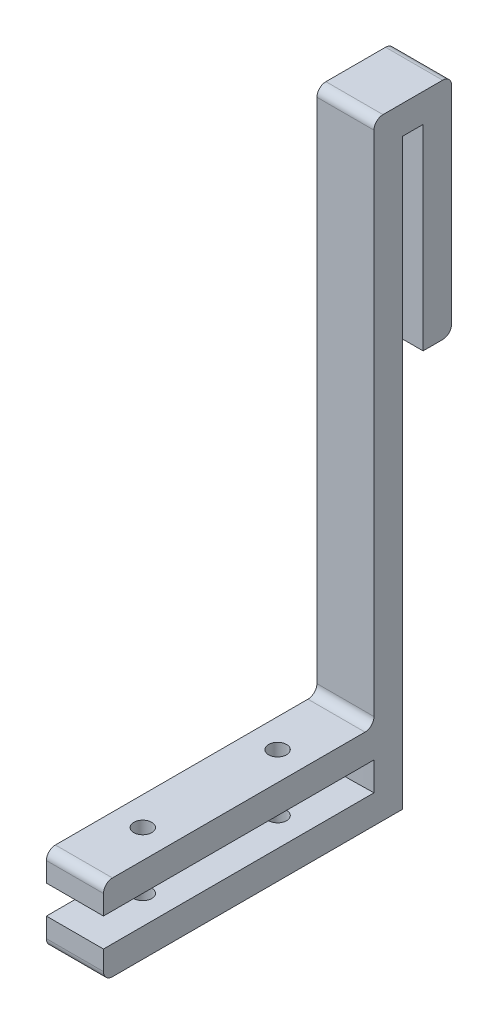
ISO-10303-21;
HEADER;
FILE_DESCRIPTION(('STEP AP214'),'2;1');
FILE_NAME('part.step','',(''),(''),'','','');
FILE_SCHEMA(('AUTOMOTIVE_DESIGN { 1 0 10303 214 1 1 1 1 }'));
ENDSEC;
DATA;
#1=APPLICATION_CONTEXT('core data for automotive mechanical design processes');
#2=APPLICATION_PROTOCOL_DEFINITION('international standard','automotive_design',2000,#1);
#3=PRODUCT_CONTEXT('',#1,'mechanical');
#4=PRODUCT('Part','Part','',(#3));
#5=PRODUCT_RELATED_PRODUCT_CATEGORY('part','',(#4));
#6=PRODUCT_DEFINITION_FORMATION('','',#4);
#7=PRODUCT_DEFINITION_CONTEXT('part definition',#1,'design');
#8=PRODUCT_DEFINITION('design','',#6,#7);
#9=PRODUCT_DEFINITION_SHAPE('','',#8);
#10=(LENGTH_UNIT() NAMED_UNIT(*) SI_UNIT(.MILLI.,.METRE.));
#11=(NAMED_UNIT(*) PLANE_ANGLE_UNIT() SI_UNIT($,.RADIAN.));
#12=(NAMED_UNIT(*) SI_UNIT($,.STERADIAN.) SOLID_ANGLE_UNIT());
#13=UNCERTAINTY_MEASURE_WITH_UNIT(LENGTH_MEASURE(1.E-05),#10,'distance_accuracy_value','');
#14=(GEOMETRIC_REPRESENTATION_CONTEXT(3) GLOBAL_UNCERTAINTY_ASSIGNED_CONTEXT((#13)) GLOBAL_UNIT_ASSIGNED_CONTEXT((#10,
#11,#12)) REPRESENTATION_CONTEXT('',''));
#15=CARTESIAN_POINT('',(0.,0.,0.));
#16=DIRECTION('',(0.,0.,1.));
#17=DIRECTION('',(1.,0.,0.));
#18=AXIS2_PLACEMENT_3D('',#15,#16,#17);
#19=CARTESIAN_POINT('',(0.,6.35,0.));
#20=DIRECTION('',(0.,-1.,0.));
#21=DIRECTION('',(0.,0.,-1.));
#22=AXIS2_PLACEMENT_3D('',#19,#20,#21);
#23=PLANE('',#22);
#24=CARTESIAN_POINT('',(6.35,6.35,-45.099));
#25=DIRECTION('',(0.,-1.,0.));
#26=DIRECTION('',(0.,0.,-1.));
#27=AXIS2_PLACEMENT_3D('',#24,#25,#26);
#28=CIRCLE('',#27,2.);
#29=CARTESIAN_POINT('',(6.35,6.35,-47.099));
#30=VERTEX_POINT('',#29);
#31=EDGE_CURVE('E207',#30,#30,#28,.T.);
#32=ORIENTED_EDGE('',*,*,#31,.T.);
#33=EDGE_LOOP('',(#32));
#34=FACE_BOUND('',#33,.T.);
#35=CARTESIAN_POINT('',(6.35,6.35,-15.099));
#36=DIRECTION('',(0.,-1.,0.));
#37=DIRECTION('',(0.,0.,-1.));
#38=AXIS2_PLACEMENT_3D('',#35,#36,#37);
#39=CIRCLE('',#38,2.);
#40=CARTESIAN_POINT('',(6.35,6.35,-17.099));
#41=VERTEX_POINT('',#40);
#42=EDGE_CURVE('E673',#41,#41,#39,.T.);
#43=ORIENTED_EDGE('',*,*,#42,.T.);
#44=EDGE_LOOP('',(#43));
#45=FACE_BOUND('',#44,.T.);
#46=CARTESIAN_POINT('',(6.35,6.35,-282.357267193606));
#47=DIRECTION('',(0.,1.,0.));
#48=DIRECTION('',(0.,0.,-1.));
#49=AXIS2_PLACEMENT_3D('',#46,#47,#48);
#50=CIRCLE('',#49,222.25);
#51=CARTESIAN_POINT('',(0.,6.35,-60.198));
#52=VERTEX_POINT('',#51);
#53=CARTESIAN_POINT('',(12.7,6.35,-60.198));
#54=VERTEX_POINT('',#53);
#55=EDGE_CURVE('E202',#52,#54,#50,.T.);
#56=ORIENTED_EDGE('',*,*,#55,.F.);
#57=DIRECTION('',(0.,0.,1.));
#58=VECTOR('',#57,1.);
#59=CARTESIAN_POINT('',(0.,6.35,0.));
#60=LINE('',#59,#58);
#61=CARTESIAN_POINT('',(0.,6.35,0.));
#62=VERTEX_POINT('',#61);
#63=EDGE_CURVE('E192',#52,#62,#60,.T.);
#64=ORIENTED_EDGE('',*,*,#63,.T.);
#65=DIRECTION('',(1.,0.,0.));
#66=VECTOR('',#65,1.);
#67=CARTESIAN_POINT('',(0.,6.35,0.));
#68=LINE('',#67,#66);
#69=CARTESIAN_POINT('',(12.7,6.35,0.));
#70=VERTEX_POINT('',#69);
#71=EDGE_CURVE('E262',#62,#70,#68,.T.);
#72=ORIENTED_EDGE('',*,*,#71,.T.);
#73=DIRECTION('',(0.,0.,-1.));
#74=VECTOR('',#73,1.);
#75=CARTESIAN_POINT('',(12.7,6.35,0.));
#76=LINE('',#75,#74);
#77=EDGE_CURVE('E265',#70,#54,#76,.T.);
#78=ORIENTED_EDGE('',*,*,#77,.T.);
#79=EDGE_LOOP('',(#56,#64,#72,#78));
#80=FACE_BOUND('',#79,.T.);
#81=ADVANCED_FACE('F37',(#34,#45,#80),#23,.F.);
#82=CARTESIAN_POINT('',(0.,12.7,0.));
#83=DIRECTION('',(0.,1.,0.));
#84=DIRECTION('',(0.,0.,1.));
#85=AXIS2_PLACEMENT_3D('',#82,#83,#84);
#86=PLANE('',#85);
#87=CARTESIAN_POINT('',(6.35,12.7,-45.099));
#88=DIRECTION('',(0.,1.,0.));
#89=DIRECTION('',(0.,0.,1.));
#90=AXIS2_PLACEMENT_3D('',#87,#88,#89);
#91=CIRCLE('',#90,2.);
#92=CARTESIAN_POINT('',(6.35,12.7,-43.099));
#93=VERTEX_POINT('',#92);
#94=EDGE_CURVE('E671',#93,#93,#91,.T.);
#95=ORIENTED_EDGE('',*,*,#94,.T.);
#96=EDGE_LOOP('',(#95));
#97=FACE_BOUND('',#96,.T.);
#98=CARTESIAN_POINT('',(6.35,12.7,-15.099));
#99=DIRECTION('',(0.,1.,0.));
#100=DIRECTION('',(0.,0.,1.));
#101=AXIS2_PLACEMENT_3D('',#98,#99,#100);
#102=CIRCLE('',#101,2.);
#103=CARTESIAN_POINT('',(6.35,12.7,-13.099));
#104=VERTEX_POINT('',#103);
#105=EDGE_CURVE('E676',#104,#104,#102,.T.);
#106=ORIENTED_EDGE('',*,*,#105,.T.);
#107=EDGE_LOOP('',(#106));
#108=FACE_BOUND('',#107,.T.);
#109=CARTESIAN_POINT('',(6.35,12.7,-282.357267193606));
#110=DIRECTION('',(0.,1.,0.));
#111=DIRECTION('',(0.,0.,-1.));
#112=AXIS2_PLACEMENT_3D('',#109,#110,#111);
#113=CIRCLE('',#112,222.25);
#114=CARTESIAN_POINT('',(0.,12.7,-60.198));
#115=VERTEX_POINT('',#114);
#116=CARTESIAN_POINT('',(12.7,12.7,-60.198));
#117=VERTEX_POINT('',#116);
#118=EDGE_CURVE('E178',#115,#117,#113,.T.);
#119=ORIENTED_EDGE('',*,*,#118,.T.);
#120=DIRECTION('',(0.,0.,-1.));
#121=VECTOR('',#120,1.);
#122=CARTESIAN_POINT('',(12.7,12.7,-66.548));
#123=LINE('',#122,#121);
#124=CARTESIAN_POINT('',(12.7,12.7,0.));
#125=VERTEX_POINT('',#124);
#126=EDGE_CURVE('E252',#125,#117,#123,.T.);
#127=ORIENTED_EDGE('',*,*,#126,.F.);
#128=DIRECTION('',(1.,0.,0.));
#129=VECTOR('',#128,1.);
#130=CARTESIAN_POINT('',(0.,12.7,0.));
#131=LINE('',#130,#129);
#132=CARTESIAN_POINT('',(0.,12.7,0.));
#133=VERTEX_POINT('',#132);
#134=EDGE_CURVE('E181',#133,#125,#131,.T.);
#135=ORIENTED_EDGE('',*,*,#134,.F.);
#136=DIRECTION('',(0.,0.,1.));
#137=VECTOR('',#136,1.);
#138=CARTESIAN_POINT('',(0.,12.7,-66.548));
#139=LINE('',#138,#137);
#140=EDGE_CURVE('E173',#115,#133,#139,.T.);
#141=ORIENTED_EDGE('',*,*,#140,.F.);
#142=EDGE_LOOP('',(#119,#127,#135,#141));
#143=FACE_BOUND('',#142,.T.);
#144=ADVANCED_FACE('F175',(#97,#108,#143),#86,.F.);
#145=CARTESIAN_POINT('',(0.,6.35,-66.548));
#146=DIRECTION('',(0.,0.,1.));
#147=DIRECTION('',(1.,0.,0.));
#148=AXIS2_PLACEMENT_3D('',#145,#146,#147);
#149=PLANE('',#148);
#150=DIRECTION('',(-1.,0.,0.));
#151=VECTOR('',#150,1.);
#152=CARTESIAN_POINT('',(12.7,129.7,-66.548));
#153=LINE('',#152,#151);
#154=CARTESIAN_POINT('',(12.7,129.7,-66.548));
#155=VERTEX_POINT('',#154);
#156=CARTESIAN_POINT('',(0.,129.7,-66.548));
#157=VERTEX_POINT('',#156);
#158=EDGE_CURVE('E227',#155,#157,#153,.T.);
#159=ORIENTED_EDGE('',*,*,#158,.F.);
#160=DIRECTION('',(0.,-1.,0.));
#161=VECTOR('',#160,1.);
#162=CARTESIAN_POINT('',(12.7,6.35,-66.548));
#163=LINE('',#162,#161);
#164=CARTESIAN_POINT('',(12.7,0.,-66.548));
#165=VERTEX_POINT('',#164);
#166=EDGE_CURVE('E274',#155,#165,#163,.T.);
#167=ORIENTED_EDGE('',*,*,#166,.T.);
#168=DIRECTION('',(-1.,0.,0.));
#169=VECTOR('',#168,1.);
#170=CARTESIAN_POINT('',(0.,0.,-66.548));
#171=LINE('',#170,#169);
#172=CARTESIAN_POINT('',(0.,0.,-66.548));
#173=VERTEX_POINT('',#172);
#174=EDGE_CURVE('E263',#165,#173,#171,.T.);
#175=ORIENTED_EDGE('',*,*,#174,.T.);
#176=DIRECTION('',(0.,-1.,0.));
#177=VECTOR('',#176,1.);
#178=CARTESIAN_POINT('',(0.,6.35,-66.548));
#179=LINE('',#178,#177);
#180=EDGE_CURVE('E267',#157,#173,#179,.T.);
#181=ORIENTED_EDGE('',*,*,#180,.F.);
#182=EDGE_LOOP('',(#159,#167,#175,#181));
#183=FACE_BOUND('',#182,.T.);
#184=ADVANCED_FACE('F377',(#183),#149,.F.);
#185=CARTESIAN_POINT('',(0.,6.35,0.));
#186=DIRECTION('',(1.,0.,0.));
#187=DIRECTION('',(0.,0.,-1.));
#188=AXIS2_PLACEMENT_3D('',#185,#186,#187);
#189=PLANE('',#188);
#190=DIRECTION('',(0.,0.,1.));
#191=VECTOR('',#190,1.);
#192=CARTESIAN_POINT('',(0.,0.,0.));
#193=LINE('',#192,#191);
#194=CARTESIAN_POINT('',(0.,0.,-2.));
#195=VERTEX_POINT('',#194);
#196=EDGE_CURVE('E195',#173,#195,#193,.T.);
#197=ORIENTED_EDGE('',*,*,#196,.T.);
#198=CARTESIAN_POINT('',(0.,2.,-2.));
#199=DIRECTION('',(1.,0.,0.));
#200=DIRECTION('',(0.,0.,-1.));
#201=AXIS2_PLACEMENT_3D('',#198,#199,#200);
#202=CIRCLE('',#201,2.);
#203=CARTESIAN_POINT('',(0.,2.,0.));
#204=VERTEX_POINT('',#203);
#205=EDGE_CURVE('E307',#195,#204,#202,.F.);
#206=ORIENTED_EDGE('',*,*,#205,.T.);
#207=DIRECTION('',(0.,-1.,0.));
#208=VECTOR('',#207,1.);
#209=CARTESIAN_POINT('',(0.,6.35,0.));
#210=LINE('',#209,#208);
#211=EDGE_CURVE('E280',#62,#204,#210,.T.);
#212=ORIENTED_EDGE('',*,*,#211,.F.);
#213=ORIENTED_EDGE('',*,*,#63,.F.);
#214=DIRECTION('',(0.,-1.,0.));
#215=VECTOR('',#214,1.);
#216=CARTESIAN_POINT('',(0.,12.7,-60.198));
#217=LINE('',#216,#215);
#218=EDGE_CURVE('E188',#115,#52,#217,.T.);
#219=ORIENTED_EDGE('',*,*,#218,.F.);
#220=ORIENTED_EDGE('',*,*,#140,.T.);
#221=DIRECTION('',(0.,-1.,0.));
#222=VECTOR('',#221,1.);
#223=CARTESIAN_POINT('',(0.,19.05,0.));
#224=LINE('',#223,#222);
#225=CARTESIAN_POINT('',(0.,17.05,0.));
#226=VERTEX_POINT('',#225);
#227=EDGE_CURVE('E258',#226,#133,#224,.T.);
#228=ORIENTED_EDGE('',*,*,#227,.F.);
#229=CARTESIAN_POINT('',(0.,17.05,-2.));
#230=DIRECTION('',(1.,0.,0.));
#231=DIRECTION('',(0.,0.,-1.));
#232=AXIS2_PLACEMENT_3D('',#229,#230,#231);
#233=CIRCLE('',#232,2.);
#234=CARTESIAN_POINT('',(0.,19.05,-2.));
#235=VERTEX_POINT('',#234);
#236=EDGE_CURVE('E304',#226,#235,#233,.F.);
#237=ORIENTED_EDGE('',*,*,#236,.T.);
#238=DIRECTION('',(0.,0.,1.));
#239=VECTOR('',#238,1.);
#240=CARTESIAN_POINT('',(0.,19.05,-66.548));
#241=LINE('',#240,#239);
#242=CARTESIAN_POINT('',(0.,19.05,-58.198));
#243=VERTEX_POINT('',#242);
#244=EDGE_CURVE('E249',#243,#235,#241,.T.);
#245=ORIENTED_EDGE('',*,*,#244,.F.);
#246=CARTESIAN_POINT('',(0.,21.05,-58.198));
#247=DIRECTION('',(1.,0.,0.));
#248=DIRECTION('',(0.,0.,-1.));
#249=AXIS2_PLACEMENT_3D('',#246,#247,#248);
#250=CIRCLE('',#249,2.);
#251=CARTESIAN_POINT('',(0.,21.05,-60.198));
#252=VERTEX_POINT('',#251);
#253=EDGE_CURVE('E11',#243,#252,#250,.T.);
#254=ORIENTED_EDGE('',*,*,#253,.T.);
#255=DIRECTION('',(0.,-1.,0.));
#256=VECTOR('',#255,1.);
#257=CARTESIAN_POINT('',(0.,136.05,-60.198));
#258=LINE('',#257,#256);
#259=CARTESIAN_POINT('',(0.,134.05,-60.198));
#260=VERTEX_POINT('',#259);
#261=EDGE_CURVE('E184',#260,#252,#258,.T.);
#262=ORIENTED_EDGE('',*,*,#261,.F.);
#263=CARTESIAN_POINT('',(0.,134.05,-62.198));
#264=DIRECTION('',(1.,0.,0.));
#265=DIRECTION('',(0.,0.,-1.));
#266=AXIS2_PLACEMENT_3D('',#263,#264,#265);
#267=CIRCLE('',#266,2.);
#268=CARTESIAN_POINT('',(0.,136.05,-62.198));
#269=VERTEX_POINT('',#268);
#270=EDGE_CURVE('E298',#260,#269,#267,.F.);
#271=ORIENTED_EDGE('',*,*,#270,.T.);
#272=DIRECTION('',(0.,0.,1.));
#273=VECTOR('',#272,1.);
#274=CARTESIAN_POINT('',(0.,136.05,-66.548));
#275=LINE('',#274,#273);
#276=CARTESIAN_POINT('',(0.,136.05,-75.47));
#277=VERTEX_POINT('',#276);
#278=EDGE_CURVE('E239',#277,#269,#275,.T.);
#279=ORIENTED_EDGE('',*,*,#278,.F.);
#280=CARTESIAN_POINT('',(0.,134.05,-75.47));
#281=DIRECTION('',(1.,0.,0.));
#282=DIRECTION('',(0.,0.,-1.));
#283=AXIS2_PLACEMENT_3D('',#280,#281,#282);
#284=CIRCLE('',#283,2.);
#285=CARTESIAN_POINT('',(0.,134.05,-77.47));
#286=VERTEX_POINT('',#285);
#287=EDGE_CURVE('E300',#277,#286,#284,.F.);
#288=ORIENTED_EDGE('',*,*,#287,.T.);
#289=DIRECTION('',(0.,1.,0.));
#290=VECTOR('',#289,1.);
#291=CARTESIAN_POINT('',(0.,136.05,-77.47));
#292=LINE('',#291,#290);
#293=CARTESIAN_POINT('',(0.,88.05,-77.47));
#294=VERTEX_POINT('',#293);
#295=EDGE_CURVE('E215',#294,#286,#292,.T.);
#296=ORIENTED_EDGE('',*,*,#295,.F.);
#297=CARTESIAN_POINT('',(0.,88.05,-75.47));
#298=DIRECTION('',(1.,0.,0.));
#299=DIRECTION('',(0.,0.,-1.));
#300=AXIS2_PLACEMENT_3D('',#297,#298,#299);
#301=CIRCLE('',#300,2.);
#302=CARTESIAN_POINT('',(0.,86.05,-75.47));
#303=VERTEX_POINT('',#302);
#304=EDGE_CURVE('E302',#294,#303,#301,.F.);
#305=ORIENTED_EDGE('',*,*,#304,.T.);
#306=DIRECTION('',(0.,0.,1.));
#307=VECTOR('',#306,1.);
#308=CARTESIAN_POINT('',(0.,86.05,-77.47));
#309=LINE('',#308,#307);
#310=CARTESIAN_POINT('',(0.,86.05,-71.12));
#311=VERTEX_POINT('',#310);
#312=EDGE_CURVE('E218',#303,#311,#309,.T.);
#313=ORIENTED_EDGE('',*,*,#312,.T.);
#314=DIRECTION('',(0.,1.,0.));
#315=VECTOR('',#314,1.);
#316=CARTESIAN_POINT('',(0.,136.05,-71.12));
#317=LINE('',#316,#315);
#318=CARTESIAN_POINT('',(0.,129.7,-71.12));
#319=VERTEX_POINT('',#318);
#320=EDGE_CURVE('E216',#311,#319,#317,.T.);
#321=ORIENTED_EDGE('',*,*,#320,.T.);
#322=DIRECTION('',(0.,0.,1.));
#323=VECTOR('',#322,1.);
#324=CARTESIAN_POINT('',(0.,129.7,-71.12));
#325=LINE('',#324,#323);
#326=EDGE_CURVE('E231',#319,#157,#325,.T.);
#327=ORIENTED_EDGE('',*,*,#326,.T.);
#328=ORIENTED_EDGE('',*,*,#180,.T.);
#329=EDGE_LOOP('',(#197,#206,#212,#213,#219,#220,#228,#237,#245,#254,#262,#271,#279,#288,#296,
#305,#313,#321,#327,#328));
#330=FACE_BOUND('',#329,.T.);
#331=ADVANCED_FACE('F190',(#330),#189,.F.);
#332=CARTESIAN_POINT('',(0.,6.35,0.));
#333=DIRECTION('',(0.,0.,-1.));
#334=DIRECTION('',(-1.,0.,0.));
#335=AXIS2_PLACEMENT_3D('',#332,#333,#334);
#336=PLANE('',#335);
#337=ORIENTED_EDGE('',*,*,#211,.T.);
#338=DIRECTION('',(1.,0.,0.));
#339=VECTOR('',#338,1.);
#340=CARTESIAN_POINT('',(12.7,2.,0.));
#341=LINE('',#340,#339);
#342=CARTESIAN_POINT('',(12.7,2.,0.));
#343=VERTEX_POINT('',#342);
#344=EDGE_CURVE('E283',#204,#343,#341,.T.);
#345=ORIENTED_EDGE('',*,*,#344,.T.);
#346=DIRECTION('',(0.,-1.,0.));
#347=VECTOR('',#346,1.);
#348=CARTESIAN_POINT('',(12.7,6.35,0.));
#349=LINE('',#348,#347);
#350=EDGE_CURVE('E277',#70,#343,#349,.T.);
#351=ORIENTED_EDGE('',*,*,#350,.F.);
#352=ORIENTED_EDGE('',*,*,#71,.F.);
#353=EDGE_LOOP('',(#337,#345,#351,#352));
#354=FACE_BOUND('',#353,.T.);
#355=ADVANCED_FACE('F390',(#354),#336,.F.);
#356=CARTESIAN_POINT('',(12.7,6.35,0.));
#357=DIRECTION('',(-1.,0.,0.));
#358=DIRECTION('',(0.,0.,1.));
#359=AXIS2_PLACEMENT_3D('',#356,#357,#358);
#360=PLANE('',#359);
#361=ORIENTED_EDGE('',*,*,#350,.T.);
#362=CARTESIAN_POINT('',(12.7,2.,-2.));
#363=DIRECTION('',(-1.,0.,0.));
#364=DIRECTION('',(0.,0.,1.));
#365=AXIS2_PLACEMENT_3D('',#362,#363,#364);
#366=CIRCLE('',#365,2.);
#367=CARTESIAN_POINT('',(12.7,0.,-2.));
#368=VERTEX_POINT('',#367);
#369=EDGE_CURVE('E294',#343,#368,#366,.F.);
#370=ORIENTED_EDGE('',*,*,#369,.T.);
#371=DIRECTION('',(0.,0.,-1.));
#372=VECTOR('',#371,1.);
#373=CARTESIAN_POINT('',(12.7,0.,0.));
#374=LINE('',#373,#372);
#375=EDGE_CURVE('E269',#368,#165,#374,.T.);
#376=ORIENTED_EDGE('',*,*,#375,.T.);
#377=ORIENTED_EDGE('',*,*,#166,.F.);
#378=DIRECTION('',(0.,0.,1.));
#379=VECTOR('',#378,1.);
#380=CARTESIAN_POINT('',(12.7,129.7,-71.12));
#381=LINE('',#380,#379);
#382=CARTESIAN_POINT('',(12.7,129.7,-71.12));
#383=VERTEX_POINT('',#382);
#384=EDGE_CURVE('E236',#383,#155,#381,.T.);
#385=ORIENTED_EDGE('',*,*,#384,.F.);
#386=DIRECTION('',(0.,-1.,0.));
#387=VECTOR('',#386,1.);
#388=CARTESIAN_POINT('',(12.7,136.05,-71.12));
#389=LINE('',#388,#387);
#390=CARTESIAN_POINT('',(12.7,86.05,-71.12));
#391=VERTEX_POINT('',#390);
#392=EDGE_CURVE('E201',#383,#391,#389,.T.);
#393=ORIENTED_EDGE('',*,*,#392,.T.);
#394=DIRECTION('',(0.,0.,1.));
#395=VECTOR('',#394,1.);
#396=CARTESIAN_POINT('',(12.7,86.05,-77.47));
#397=LINE('',#396,#395);
#398=CARTESIAN_POINT('',(12.7,86.05,-75.47));
#399=VERTEX_POINT('',#398);
#400=EDGE_CURVE('E225',#399,#391,#397,.T.);
#401=ORIENTED_EDGE('',*,*,#400,.F.);
#402=CARTESIAN_POINT('',(12.7,88.05,-75.47));
#403=DIRECTION('',(-1.,0.,0.));
#404=DIRECTION('',(0.,0.,1.));
#405=AXIS2_PLACEMENT_3D('',#402,#403,#404);
#406=CIRCLE('',#405,2.);
#407=CARTESIAN_POINT('',(12.7,88.05,-77.47));
#408=VERTEX_POINT('',#407);
#409=EDGE_CURVE('E290',#399,#408,#406,.F.);
#410=ORIENTED_EDGE('',*,*,#409,.T.);
#411=DIRECTION('',(0.,-1.,0.));
#412=VECTOR('',#411,1.);
#413=CARTESIAN_POINT('',(12.7,136.05,-77.47));
#414=LINE('',#413,#412);
#415=CARTESIAN_POINT('',(12.7,134.05,-77.47));
#416=VERTEX_POINT('',#415);
#417=EDGE_CURVE('E212',#416,#408,#414,.T.);
#418=ORIENTED_EDGE('',*,*,#417,.F.);
#419=CARTESIAN_POINT('',(12.7,134.05,-75.47));
#420=DIRECTION('',(-1.,0.,0.));
#421=DIRECTION('',(0.,0.,1.));
#422=AXIS2_PLACEMENT_3D('',#419,#420,#421);
#423=CIRCLE('',#422,2.);
#424=CARTESIAN_POINT('',(12.7,136.05,-75.47));
#425=VERTEX_POINT('',#424);
#426=EDGE_CURVE('E288',#416,#425,#423,.F.);
#427=ORIENTED_EDGE('',*,*,#426,.T.);
#428=DIRECTION('',(0.,0.,-1.));
#429=VECTOR('',#428,1.);
#430=CARTESIAN_POINT('',(12.7,136.05,-66.548));
#431=LINE('',#430,#429);
#432=CARTESIAN_POINT('',(12.7,136.05,-62.198));
#433=VERTEX_POINT('',#432);
#434=EDGE_CURVE('E242',#433,#425,#431,.T.);
#435=ORIENTED_EDGE('',*,*,#434,.F.);
#436=CARTESIAN_POINT('',(12.7,134.05,-62.198));
#437=DIRECTION('',(-1.,0.,0.));
#438=DIRECTION('',(0.,0.,1.));
#439=AXIS2_PLACEMENT_3D('',#436,#437,#438);
#440=CIRCLE('',#439,2.);
#441=CARTESIAN_POINT('',(12.7,134.05,-60.198));
#442=VERTEX_POINT('',#441);
#443=EDGE_CURVE('E286',#433,#442,#440,.F.);
#444=ORIENTED_EDGE('',*,*,#443,.T.);
#445=DIRECTION('',(0.,-1.,0.));
#446=VECTOR('',#445,1.);
#447=CARTESIAN_POINT('',(12.7,136.05,-60.198));
#448=LINE('',#447,#446);
#449=CARTESIAN_POINT('',(12.7,21.05,-60.198));
#450=VERTEX_POINT('',#449);
#451=EDGE_CURVE('E245',#442,#450,#448,.T.);
#452=ORIENTED_EDGE('',*,*,#451,.T.);
#453=CARTESIAN_POINT('',(12.7,21.05,-58.198));
#454=DIRECTION('',(-1.,0.,0.));
#455=DIRECTION('',(0.,0.,1.));
#456=AXIS2_PLACEMENT_3D('',#453,#454,#455);
#457=CIRCLE('',#456,2.);
#458=CARTESIAN_POINT('',(12.7,19.05,-58.198));
#459=VERTEX_POINT('',#458);
#460=EDGE_CURVE('E45',#450,#459,#457,.T.);
#461=ORIENTED_EDGE('',*,*,#460,.T.);
#462=DIRECTION('',(0.,0.,-1.));
#463=VECTOR('',#462,1.);
#464=CARTESIAN_POINT('',(12.7,19.05,-66.548));
#465=LINE('',#464,#463);
#466=CARTESIAN_POINT('',(12.7,19.05,-2.));
#467=VERTEX_POINT('',#466);
#468=EDGE_CURVE('E251',#467,#459,#465,.T.);
#469=ORIENTED_EDGE('',*,*,#468,.F.);
#470=CARTESIAN_POINT('',(12.7,17.05,-2.));
#471=DIRECTION('',(-1.,0.,0.));
#472=DIRECTION('',(0.,0.,1.));
#473=AXIS2_PLACEMENT_3D('',#470,#471,#472);
#474=CIRCLE('',#473,2.);
#475=CARTESIAN_POINT('',(12.7,17.05,0.));
#476=VERTEX_POINT('',#475);
#477=EDGE_CURVE('E292',#467,#476,#474,.F.);
#478=ORIENTED_EDGE('',*,*,#477,.T.);
#479=DIRECTION('',(0.,-1.,0.));
#480=VECTOR('',#479,1.);
#481=CARTESIAN_POINT('',(12.7,19.05,0.));
#482=LINE('',#481,#480);
#483=EDGE_CURVE('E253',#476,#125,#482,.T.);
#484=ORIENTED_EDGE('',*,*,#483,.T.);
#485=ORIENTED_EDGE('',*,*,#126,.T.);
#486=DIRECTION('',(0.,-1.,0.));
#487=VECTOR('',#486,1.);
#488=CARTESIAN_POINT('',(12.7,12.7,-60.198));
#489=LINE('',#488,#487);
#490=EDGE_CURVE('E196',#117,#54,#489,.T.);
#491=ORIENTED_EDGE('',*,*,#490,.T.);
#492=ORIENTED_EDGE('',*,*,#77,.F.);
#493=EDGE_LOOP('',(#361,#370,#376,#377,#385,#393,#401,#410,#418,#427,#435,#444,#452,#461,#469,
#478,#484,#485,#491,#492));
#494=FACE_BOUND('',#493,.T.);
#495=ADVANCED_FACE('F340',(#494),#360,.F.);
#496=CARTESIAN_POINT('',(0.,0.,0.));
#497=DIRECTION('',(0.,-1.,0.));
#498=DIRECTION('',(0.,0.,-1.));
#499=AXIS2_PLACEMENT_3D('',#496,#497,#498);
#500=PLANE('',#499);
#501=CARTESIAN_POINT('',(6.35,0.,-45.099));
#502=DIRECTION('',(0.,1.,0.));
#503=DIRECTION('',(0.,0.,1.));
#504=AXIS2_PLACEMENT_3D('',#501,#502,#503);
#505=CIRCLE('',#504,2.);
#506=CARTESIAN_POINT('',(6.35,0.,-43.099));
#507=VERTEX_POINT('',#506);
#508=EDGE_CURVE('E669',#507,#507,#505,.T.);
#509=ORIENTED_EDGE('',*,*,#508,.T.);
#510=EDGE_LOOP('',(#509));
#511=FACE_BOUND('',#510,.T.);
#512=CARTESIAN_POINT('',(6.35,0.,-15.099));
#513=DIRECTION('',(0.,1.,0.));
#514=DIRECTION('',(0.,0.,-1.));
#515=AXIS2_PLACEMENT_3D('',#512,#513,#514);
#516=CIRCLE('',#515,2.);
#517=CARTESIAN_POINT('',(6.35,0.,-17.099));
#518=VERTEX_POINT('',#517);
#519=EDGE_CURVE('E684',#518,#518,#516,.T.);
#520=ORIENTED_EDGE('',*,*,#519,.T.);
#521=EDGE_LOOP('',(#520));
#522=FACE_BOUND('',#521,.T.);
#523=ORIENTED_EDGE('',*,*,#375,.F.);
#524=DIRECTION('',(1.,0.,0.));
#525=VECTOR('',#524,1.);
#526=CARTESIAN_POINT('',(0.,0.,-2.));
#527=LINE('',#526,#525);
#528=EDGE_CURVE('E296',#368,#195,#527,.F.);
#529=ORIENTED_EDGE('',*,*,#528,.T.);
#530=ORIENTED_EDGE('',*,*,#196,.F.);
#531=ORIENTED_EDGE('',*,*,#174,.F.);
#532=EDGE_LOOP('',(#523,#529,#530,#531));
#533=FACE_BOUND('',#532,.T.);
#534=ADVANCED_FACE('F382',(#511,#522,#533),#500,.T.);
#535=CARTESIAN_POINT('',(0.,19.05,0.));
#536=DIRECTION('',(0.,0.,-1.));
#537=DIRECTION('',(-1.,0.,0.));
#538=AXIS2_PLACEMENT_3D('',#535,#536,#537);
#539=PLANE('',#538);
#540=ORIENTED_EDGE('',*,*,#483,.F.);
#541=DIRECTION('',(1.,0.,0.));
#542=VECTOR('',#541,1.);
#543=CARTESIAN_POINT('',(0.,17.05,0.));
#544=LINE('',#543,#542);
#545=EDGE_CURVE('E312',#476,#226,#544,.F.);
#546=ORIENTED_EDGE('',*,*,#545,.T.);
#547=ORIENTED_EDGE('',*,*,#227,.T.);
#548=ORIENTED_EDGE('',*,*,#134,.T.);
#549=EDGE_LOOP('',(#540,#546,#547,#548));
#550=FACE_BOUND('',#549,.T.);
#551=ADVANCED_FACE('F397',(#550),#539,.F.);
#552=CARTESIAN_POINT('',(0.,19.05,0.));
#553=DIRECTION('',(0.,1.,0.));
#554=DIRECTION('',(0.,0.,1.));
#555=AXIS2_PLACEMENT_3D('',#552,#553,#554);
#556=PLANE('',#555);
#557=CARTESIAN_POINT('',(6.35,19.05,-45.099));
#558=DIRECTION('',(0.,1.,0.));
#559=DIRECTION('',(0.,0.,1.));
#560=AXIS2_PLACEMENT_3D('',#557,#558,#559);
#561=CIRCLE('',#560,2.);
#562=CARTESIAN_POINT('',(6.35,19.05,-43.099));
#563=VERTEX_POINT('',#562);
#564=EDGE_CURVE('E687',#563,#563,#561,.T.);
#565=ORIENTED_EDGE('',*,*,#564,.F.);
#566=EDGE_LOOP('',(#565));
#567=FACE_BOUND('',#566,.T.);
#568=CARTESIAN_POINT('',(6.35,19.05,-15.099));
#569=DIRECTION('',(0.,1.,0.));
#570=DIRECTION('',(0.,0.,-1.));
#571=AXIS2_PLACEMENT_3D('',#568,#569,#570);
#572=CIRCLE('',#571,2.);
#573=CARTESIAN_POINT('',(6.35,19.05,-17.099));
#574=VERTEX_POINT('',#573);
#575=EDGE_CURVE('E681',#574,#574,#572,.T.);
#576=ORIENTED_EDGE('',*,*,#575,.F.);
#577=EDGE_LOOP('',(#576));
#578=FACE_BOUND('',#577,.T.);
#579=ORIENTED_EDGE('',*,*,#468,.T.);
#580=DIRECTION('',(1.,0.,0.));
#581=VECTOR('',#580,1.);
#582=CARTESIAN_POINT('',(0.,19.05,-58.198));
#583=LINE('',#582,#581);
#584=EDGE_CURVE('E58',#459,#243,#583,.F.);
#585=ORIENTED_EDGE('',*,*,#584,.T.);
#586=ORIENTED_EDGE('',*,*,#244,.T.);
#587=DIRECTION('',(1.,0.,0.));
#588=VECTOR('',#587,1.);
#589=CARTESIAN_POINT('',(12.7,19.05,-2.));
#590=LINE('',#589,#588);
#591=EDGE_CURVE('E309',#235,#467,#590,.T.);
#592=ORIENTED_EDGE('',*,*,#591,.T.);
#593=EDGE_LOOP('',(#579,#585,#586,#592));
#594=FACE_BOUND('',#593,.T.);
#595=ADVANCED_FACE('F402',(#567,#578,#594),#556,.T.);
#596=CARTESIAN_POINT('',(0.,136.05,-60.198));
#597=DIRECTION('',(0.,0.,-1.));
#598=DIRECTION('',(-1.,0.,0.));
#599=AXIS2_PLACEMENT_3D('',#596,#597,#598);
#600=PLANE('',#599);
#601=ORIENTED_EDGE('',*,*,#261,.T.);
#602=DIRECTION('',(1.,0.,0.));
#603=VECTOR('',#602,1.);
#604=CARTESIAN_POINT('',(0.,21.05,-60.198));
#605=LINE('',#604,#603);
#606=EDGE_CURVE('E329',#252,#450,#605,.T.);
#607=ORIENTED_EDGE('',*,*,#606,.T.);
#608=ORIENTED_EDGE('',*,*,#451,.F.);
#609=DIRECTION('',(1.,0.,0.));
#610=VECTOR('',#609,1.);
#611=CARTESIAN_POINT('',(0.,134.05,-60.198));
#612=LINE('',#611,#610);
#613=EDGE_CURVE('E327',#442,#260,#612,.F.);
#614=ORIENTED_EDGE('',*,*,#613,.T.);
#615=EDGE_LOOP('',(#601,#607,#608,#614));
#616=FACE_BOUND('',#615,.T.);
#617=ADVANCED_FACE('F335',(#616),#600,.F.);
#618=CARTESIAN_POINT('',(0.,136.05,0.));
#619=DIRECTION('',(0.,1.,0.));
#620=DIRECTION('',(0.,0.,1.));
#621=AXIS2_PLACEMENT_3D('',#618,#619,#620);
#622=PLANE('',#621);
#623=ORIENTED_EDGE('',*,*,#434,.T.);
#624=DIRECTION('',(1.,0.,0.));
#625=VECTOR('',#624,1.);
#626=CARTESIAN_POINT('',(0.,136.05,-75.47));
#627=LINE('',#626,#625);
#628=EDGE_CURVE('E325',#425,#277,#627,.F.);
#629=ORIENTED_EDGE('',*,*,#628,.T.);
#630=ORIENTED_EDGE('',*,*,#278,.T.);
#631=DIRECTION('',(1.,0.,0.));
#632=VECTOR('',#631,1.);
#633=CARTESIAN_POINT('',(12.7,136.05,-62.198));
#634=LINE('',#633,#632);
#635=EDGE_CURVE('E322',#269,#433,#634,.T.);
#636=ORIENTED_EDGE('',*,*,#635,.T.);
#637=EDGE_LOOP('',(#623,#629,#630,#636));
#638=FACE_BOUND('',#637,.T.);
#639=ADVANCED_FACE('F347',(#638),#622,.T.);
#640=CARTESIAN_POINT('',(12.7,129.7,-71.12));
#641=DIRECTION('',(0.,1.,0.));
#642=DIRECTION('',(0.,0.,1.));
#643=AXIS2_PLACEMENT_3D('',#640,#641,#642);
#644=PLANE('',#643);
#645=ORIENTED_EDGE('',*,*,#158,.T.);
#646=ORIENTED_EDGE('',*,*,#326,.F.);
#647=DIRECTION('',(-1.,0.,0.));
#648=VECTOR('',#647,1.);
#649=CARTESIAN_POINT('',(12.7,129.7,-71.12));
#650=LINE('',#649,#648);
#651=EDGE_CURVE('E228',#383,#319,#650,.T.);
#652=ORIENTED_EDGE('',*,*,#651,.F.);
#653=ORIENTED_EDGE('',*,*,#384,.T.);
#654=EDGE_LOOP('',(#645,#646,#652,#653));
#655=FACE_BOUND('',#654,.T.);
#656=ADVANCED_FACE('F373',(#655),#644,.F.);
#657=CARTESIAN_POINT('',(0.,0.,-71.12));
#658=DIRECTION('',(0.,0.,-1.));
#659=DIRECTION('',(-1.,0.,0.));
#660=AXIS2_PLACEMENT_3D('',#657,#658,#659);
#661=PLANE('',#660);
#662=ORIENTED_EDGE('',*,*,#392,.F.);
#663=ORIENTED_EDGE('',*,*,#651,.T.);
#664=ORIENTED_EDGE('',*,*,#320,.F.);
#665=DIRECTION('',(-1.,0.,0.));
#666=VECTOR('',#665,1.);
#667=CARTESIAN_POINT('',(12.7,86.05,-71.12));
#668=LINE('',#667,#666);
#669=EDGE_CURVE('E205',#391,#311,#668,.T.);
#670=ORIENTED_EDGE('',*,*,#669,.F.);
#671=EDGE_LOOP('',(#662,#663,#664,#670));
#672=FACE_BOUND('',#671,.T.);
#673=ADVANCED_FACE('F371',(#672),#661,.F.);
#674=CARTESIAN_POINT('',(12.7,86.05,-77.47));
#675=DIRECTION('',(0.,1.,0.));
#676=DIRECTION('',(0.,0.,1.));
#677=AXIS2_PLACEMENT_3D('',#674,#675,#676);
#678=PLANE('',#677);
#679=ORIENTED_EDGE('',*,*,#312,.F.);
#680=DIRECTION('',(-1.,0.,0.));
#681=VECTOR('',#680,1.);
#682=CARTESIAN_POINT('',(12.7,86.05,-75.47));
#683=LINE('',#682,#681);
#684=EDGE_CURVE('E320',#303,#399,#683,.F.);
#685=ORIENTED_EDGE('',*,*,#684,.T.);
#686=ORIENTED_EDGE('',*,*,#400,.T.);
#687=ORIENTED_EDGE('',*,*,#669,.T.);
#688=EDGE_LOOP('',(#679,#685,#686,#687));
#689=FACE_BOUND('',#688,.T.);
#690=ADVANCED_FACE('F366',(#689),#678,.F.);
#691=CARTESIAN_POINT('',(0.,0.,-77.47));
#692=DIRECTION('',(0.,0.,-1.));
#693=DIRECTION('',(-1.,0.,0.));
#694=AXIS2_PLACEMENT_3D('',#691,#692,#693);
#695=PLANE('',#694);
#696=ORIENTED_EDGE('',*,*,#417,.T.);
#697=DIRECTION('',(-1.,0.,0.));
#698=VECTOR('',#697,1.);
#699=CARTESIAN_POINT('',(0.,88.05,-77.47));
#700=LINE('',#699,#698);
#701=EDGE_CURVE('E317',#408,#294,#700,.T.);
#702=ORIENTED_EDGE('',*,*,#701,.T.);
#703=ORIENTED_EDGE('',*,*,#295,.T.);
#704=DIRECTION('',(1.,0.,0.));
#705=VECTOR('',#704,1.);
#706=CARTESIAN_POINT('',(0.,134.05,-77.47));
#707=LINE('',#706,#705);
#708=EDGE_CURVE('E314',#286,#416,#707,.T.);
#709=ORIENTED_EDGE('',*,*,#708,.T.);
#710=EDGE_LOOP('',(#696,#702,#703,#709));
#711=FACE_BOUND('',#710,.T.);
#712=ADVANCED_FACE('F357',(#711),#695,.T.);
#713=CARTESIAN_POINT('',(6.35,12.7,-282.357267193606));
#714=DIRECTION('',(0.,-1.,0.));
#715=DIRECTION('',(0.,0.,-1.));
#716=AXIS2_PLACEMENT_3D('',#713,#714,#715);
#717=CYLINDRICAL_SURFACE('',#716,222.25);
#718=ORIENTED_EDGE('',*,*,#55,.T.);
#719=ORIENTED_EDGE('',*,*,#490,.F.);
#720=ORIENTED_EDGE('',*,*,#118,.F.);
#721=ORIENTED_EDGE('',*,*,#218,.T.);
#722=EDGE_LOOP('',(#718,#719,#720,#721));
#723=FACE_BOUND('',#722,.T.);
#724=ADVANCED_FACE('F199',(#723),#717,.T.);
#725=CARTESIAN_POINT('',(6.35,0.,-15.099));
#726=DIRECTION('',(0.,1.,0.));
#727=DIRECTION('',(0.,0.,1.));
#728=AXIS2_PLACEMENT_3D('',#725,#726,#727);
#729=CYLINDRICAL_SURFACE('',#728,2.);
#730=ORIENTED_EDGE('',*,*,#575,.T.);
#731=EDGE_LOOP('',(#730));
#732=FACE_BOUND('',#731,.T.);
#733=ORIENTED_EDGE('',*,*,#105,.F.);
#734=EDGE_LOOP('',(#733));
#735=FACE_BOUND('',#734,.T.);
#736=ADVANCED_FACE('F527',(#732,#735),#729,.F.);
#737=CARTESIAN_POINT('',(6.35,0.,-45.099));
#738=DIRECTION('',(0.,1.,0.));
#739=DIRECTION('',(0.,0.,1.));
#740=AXIS2_PLACEMENT_3D('',#737,#738,#739);
#741=CYLINDRICAL_SURFACE('',#740,2.);
#742=ORIENTED_EDGE('',*,*,#564,.T.);
#743=EDGE_LOOP('',(#742));
#744=FACE_BOUND('',#743,.T.);
#745=ORIENTED_EDGE('',*,*,#94,.F.);
#746=EDGE_LOOP('',(#745));
#747=FACE_BOUND('',#746,.T.);
#748=ADVANCED_FACE('F534',(#744,#747),#741,.F.);
#749=ORIENTED_EDGE('',*,*,#519,.F.);
#750=EDGE_LOOP('',(#749));
#751=FACE_BOUND('',#750,.T.);
#752=ORIENTED_EDGE('',*,*,#42,.F.);
#753=EDGE_LOOP('',(#752));
#754=FACE_BOUND('',#753,.T.);
#755=ADVANCED_FACE('F537',(#751,#754),#729,.F.);
#756=ORIENTED_EDGE('',*,*,#508,.F.);
#757=EDGE_LOOP('',(#756));
#758=FACE_BOUND('',#757,.T.);
#759=ORIENTED_EDGE('',*,*,#31,.F.);
#760=EDGE_LOOP('',(#759));
#761=FACE_BOUND('',#760,.T.);
#762=ADVANCED_FACE('F432',(#758,#761),#741,.F.);
#763=CARTESIAN_POINT('',(0.,2.,-2.));
#764=DIRECTION('',(-1.,0.,0.));
#765=DIRECTION('',(0.,0.,1.));
#766=AXIS2_PLACEMENT_3D('',#763,#764,#765);
#767=CYLINDRICAL_SURFACE('',#766,2.);
#768=ORIENTED_EDGE('',*,*,#205,.F.);
#769=ORIENTED_EDGE('',*,*,#528,.F.);
#770=ORIENTED_EDGE('',*,*,#369,.F.);
#771=ORIENTED_EDGE('',*,*,#344,.F.);
#772=EDGE_LOOP('',(#768,#769,#770,#771));
#773=FACE_BOUND('',#772,.T.);
#774=ADVANCED_FACE('F386',(#773),#767,.T.);
#775=CARTESIAN_POINT('',(0.,17.05,-2.));
#776=DIRECTION('',(-1.,0.,0.));
#777=DIRECTION('',(0.,0.,1.));
#778=AXIS2_PLACEMENT_3D('',#775,#776,#777);
#779=CYLINDRICAL_SURFACE('',#778,2.);
#780=ORIENTED_EDGE('',*,*,#236,.F.);
#781=ORIENTED_EDGE('',*,*,#545,.F.);
#782=ORIENTED_EDGE('',*,*,#477,.F.);
#783=ORIENTED_EDGE('',*,*,#591,.F.);
#784=EDGE_LOOP('',(#780,#781,#782,#783));
#785=FACE_BOUND('',#784,.T.);
#786=ADVANCED_FACE('F401',(#785),#779,.T.);
#787=CARTESIAN_POINT('',(0.,88.05,-75.47));
#788=DIRECTION('',(1.,0.,0.));
#789=DIRECTION('',(0.,0.,-1.));
#790=AXIS2_PLACEMENT_3D('',#787,#788,#789);
#791=CYLINDRICAL_SURFACE('',#790,2.);
#792=ORIENTED_EDGE('',*,*,#409,.F.);
#793=ORIENTED_EDGE('',*,*,#684,.F.);
#794=ORIENTED_EDGE('',*,*,#304,.F.);
#795=ORIENTED_EDGE('',*,*,#701,.F.);
#796=EDGE_LOOP('',(#792,#793,#794,#795));
#797=FACE_BOUND('',#796,.T.);
#798=ADVANCED_FACE('F363',(#797),#791,.T.);
#799=CARTESIAN_POINT('',(0.,134.05,-75.47));
#800=DIRECTION('',(1.,0.,0.));
#801=DIRECTION('',(0.,0.,-1.));
#802=AXIS2_PLACEMENT_3D('',#799,#800,#801);
#803=CYLINDRICAL_SURFACE('',#802,2.);
#804=ORIENTED_EDGE('',*,*,#287,.F.);
#805=ORIENTED_EDGE('',*,*,#628,.F.);
#806=ORIENTED_EDGE('',*,*,#426,.F.);
#807=ORIENTED_EDGE('',*,*,#708,.F.);
#808=EDGE_LOOP('',(#804,#805,#806,#807));
#809=FACE_BOUND('',#808,.T.);
#810=ADVANCED_FACE('F354',(#809),#803,.T.);
#811=CARTESIAN_POINT('',(0.,134.05,-62.198));
#812=DIRECTION('',(-1.,0.,0.));
#813=DIRECTION('',(0.,0.,1.));
#814=AXIS2_PLACEMENT_3D('',#811,#812,#813);
#815=CYLINDRICAL_SURFACE('',#814,2.);
#816=ORIENTED_EDGE('',*,*,#270,.F.);
#817=ORIENTED_EDGE('',*,*,#613,.F.);
#818=ORIENTED_EDGE('',*,*,#443,.F.);
#819=ORIENTED_EDGE('',*,*,#635,.F.);
#820=EDGE_LOOP('',(#816,#817,#818,#819));
#821=FACE_BOUND('',#820,.T.);
#822=ADVANCED_FACE('F345',(#821),#815,.T.);
#823=CARTESIAN_POINT('',(0.,21.05,-58.198));
#824=DIRECTION('',(1.,0.,0.));
#825=DIRECTION('',(0.,0.,-1.));
#826=AXIS2_PLACEMENT_3D('',#823,#824,#825);
#827=CYLINDRICAL_SURFACE('',#826,2.);
#828=ORIENTED_EDGE('',*,*,#253,.F.);
#829=ORIENTED_EDGE('',*,*,#584,.F.);
#830=ORIENTED_EDGE('',*,*,#460,.F.);
#831=ORIENTED_EDGE('',*,*,#606,.F.);
#832=EDGE_LOOP('',(#828,#829,#830,#831));
#833=FACE_BOUND('',#832,.T.);
#834=ADVANCED_FACE('F39',(#833),#827,.F.);
#835=CLOSED_SHELL('',(#81,#144,#184,#331,#355,#495,#534,#551,#595,#617,#639,#656,#673,#690,#712,
#724,#736,#748,#755,#762,#774,#786,#798,#810,#822,#834));
#836=MANIFOLD_SOLID_BREP('B2',#835);
#837=ADVANCED_BREP_SHAPE_REPRESENTATION('',(#18,#836),#14);
#838=SHAPE_DEFINITION_REPRESENTATION(#9,#837);
ENDSEC;
END-ISO-10303-21;
